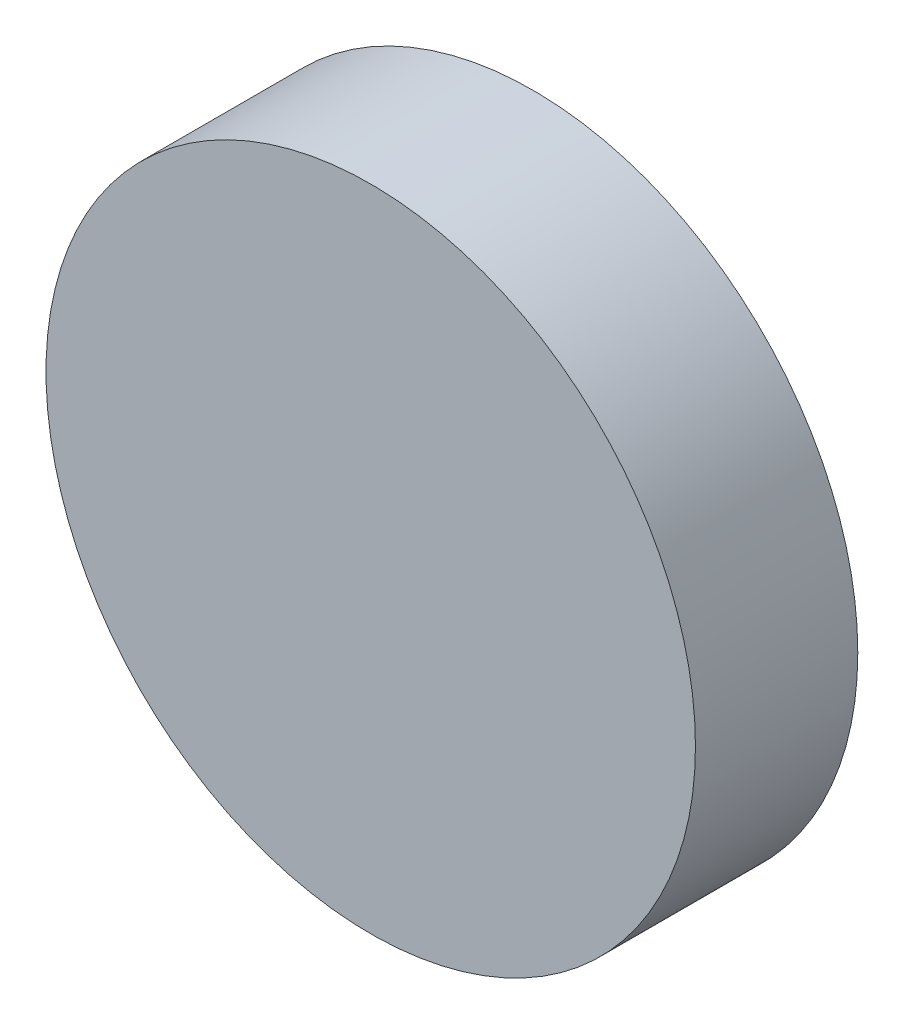
ISO-10303-21;
HEADER;
FILE_DESCRIPTION(('STEP AP214'),'2;1');
FILE_NAME('part.step','',(''),(''),'','','');
FILE_SCHEMA(('AUTOMOTIVE_DESIGN { 1 0 10303 214 1 1 1 1 }'));
ENDSEC;
DATA;
#1=APPLICATION_CONTEXT('core data for automotive mechanical design processes');
#2=APPLICATION_PROTOCOL_DEFINITION('international standard','automotive_design',2000,#1);
#3=PRODUCT_CONTEXT('',#1,'mechanical');
#4=PRODUCT('Part','Part','',(#3));
#5=PRODUCT_RELATED_PRODUCT_CATEGORY('part','',(#4));
#6=PRODUCT_DEFINITION_FORMATION('','',#4);
#7=PRODUCT_DEFINITION_CONTEXT('part definition',#1,'design');
#8=PRODUCT_DEFINITION('design','',#6,#7);
#9=PRODUCT_DEFINITION_SHAPE('','',#8);
#10=(LENGTH_UNIT() NAMED_UNIT(*) SI_UNIT(.MILLI.,.METRE.));
#11=(NAMED_UNIT(*) PLANE_ANGLE_UNIT() SI_UNIT($,.RADIAN.));
#12=(NAMED_UNIT(*) SI_UNIT($,.STERADIAN.) SOLID_ANGLE_UNIT());
#13=UNCERTAINTY_MEASURE_WITH_UNIT(LENGTH_MEASURE(1.E-05),#10,'distance_accuracy_value','');
#14=(GEOMETRIC_REPRESENTATION_CONTEXT(3) GLOBAL_UNCERTAINTY_ASSIGNED_CONTEXT((#13)) GLOBAL_UNIT_ASSIGNED_CONTEXT((#10,
#11,#12)) REPRESENTATION_CONTEXT('',''));
#15=CARTESIAN_POINT('',(0.,0.,0.));
#16=DIRECTION('',(0.,0.,1.));
#17=DIRECTION('',(1.,0.,0.));
#18=AXIS2_PLACEMENT_3D('',#15,#16,#17);
#19=CARTESIAN_POINT('',(0.,0.,2.54));
#20=DIRECTION('',(0.,0.,-1.));
#21=DIRECTION('',(-1.,0.,0.));
#22=AXIS2_PLACEMENT_3D('',#19,#20,#21);
#23=CYLINDRICAL_SURFACE('',#22,6.35);
#24=CARTESIAN_POINT('',(0.,0.,0.));
#25=DIRECTION('',(0.,0.,1.));
#26=DIRECTION('',(1.,0.,0.));
#27=AXIS2_PLACEMENT_3D('',#24,#25,#26);
#28=CIRCLE('',#27,6.35);
#29=CARTESIAN_POINT('',(6.35,0.,0.));
#30=VERTEX_POINT('',#29);
#31=EDGE_CURVE('E10',#30,#30,#28,.T.);
#32=ORIENTED_EDGE('',*,*,#31,.T.);
#33=EDGE_LOOP('',(#32));
#34=FACE_BOUND('',#33,.T.);
#35=CARTESIAN_POINT('',(0.,0.,3.175));
#36=DIRECTION('',(0.,0.,1.));
#37=DIRECTION('',(1.,0.,0.));
#38=AXIS2_PLACEMENT_3D('',#35,#36,#37);
#39=CIRCLE('',#38,6.35);
#40=CARTESIAN_POINT('',(6.35,0.,3.175));
#41=VERTEX_POINT('',#40);
#42=EDGE_CURVE('E37',#41,#41,#39,.T.);
#43=ORIENTED_EDGE('',*,*,#42,.F.);
#44=EDGE_LOOP('',(#43));
#45=FACE_BOUND('',#44,.T.);
#46=ADVANCED_FACE('F31',(#34,#45),#23,.T.);
#47=CARTESIAN_POINT('',(0.,0.,0.));
#48=DIRECTION('',(0.,0.,1.));
#49=DIRECTION('',(1.,0.,0.));
#50=AXIS2_PLACEMENT_3D('',#47,#48,#49);
#51=PLANE('',#50);
#52=ORIENTED_EDGE('',*,*,#31,.F.);
#53=EDGE_LOOP('',(#52));
#54=FACE_BOUND('',#53,.T.);
#55=ADVANCED_FACE('F46',(#54),#51,.F.);
#56=CARTESIAN_POINT('',(0.,0.,3.175));
#57=DIRECTION('',(0.,0.,1.));
#58=DIRECTION('',(1.,0.,0.));
#59=AXIS2_PLACEMENT_3D('',#56,#57,#58);
#60=PLANE('',#59);
#61=ORIENTED_EDGE('',*,*,#42,.T.);
#62=EDGE_LOOP('',(#61));
#63=FACE_BOUND('',#62,.T.);
#64=ADVANCED_FACE('F43',(#63),#60,.T.);
#65=CLOSED_SHELL('',(#46,#55,#64));
#66=MANIFOLD_SOLID_BREP('B2',#65);
#67=ADVANCED_BREP_SHAPE_REPRESENTATION('',(#18,#66),#14);
#68=SHAPE_DEFINITION_REPRESENTATION(#9,#67);
ENDSEC;
END-ISO-10303-21;
